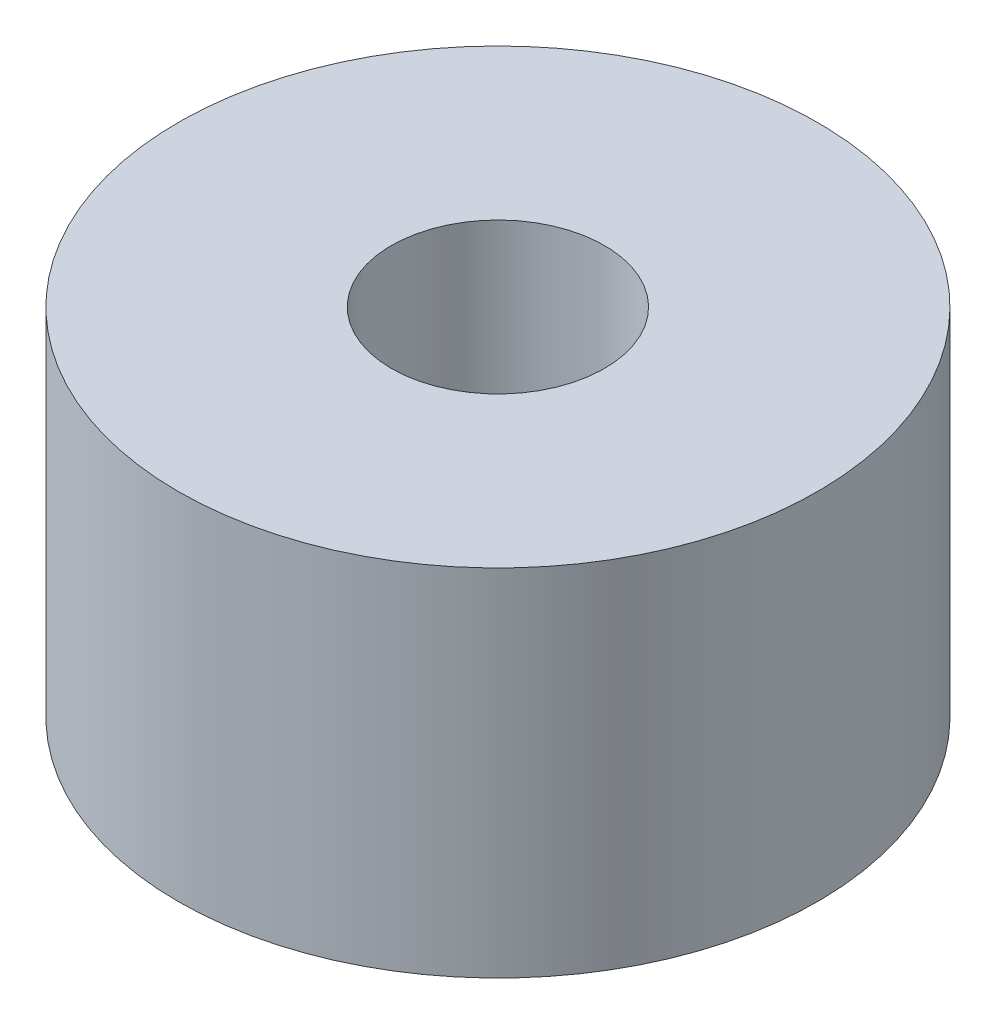
ISO-10303-21;
HEADER;
FILE_DESCRIPTION(('STEP AP214'),'2;1');
FILE_NAME('part.step','',(''),(''),'','','');
FILE_SCHEMA(('AUTOMOTIVE_DESIGN { 1 0 10303 214 1 1 1 1 }'));
ENDSEC;
DATA;
#1=APPLICATION_CONTEXT('core data for automotive mechanical design processes');
#2=APPLICATION_PROTOCOL_DEFINITION('international standard','automotive_design',2000,#1);
#3=PRODUCT_CONTEXT('',#1,'mechanical');
#4=PRODUCT('Part','Part','',(#3));
#5=PRODUCT_RELATED_PRODUCT_CATEGORY('part','',(#4));
#6=PRODUCT_DEFINITION_FORMATION('','',#4);
#7=PRODUCT_DEFINITION_CONTEXT('part definition',#1,'design');
#8=PRODUCT_DEFINITION('design','',#6,#7);
#9=PRODUCT_DEFINITION_SHAPE('','',#8);
#10=(LENGTH_UNIT() NAMED_UNIT(*) SI_UNIT(.MILLI.,.METRE.));
#11=(NAMED_UNIT(*) PLANE_ANGLE_UNIT() SI_UNIT($,.RADIAN.));
#12=(NAMED_UNIT(*) SI_UNIT($,.STERADIAN.) SOLID_ANGLE_UNIT());
#13=UNCERTAINTY_MEASURE_WITH_UNIT(LENGTH_MEASURE(1.E-05),#10,'distance_accuracy_value','');
#14=(GEOMETRIC_REPRESENTATION_CONTEXT(3) GLOBAL_UNCERTAINTY_ASSIGNED_CONTEXT((#13)) GLOBAL_UNIT_ASSIGNED_CONTEXT((#10,
#11,#12)) REPRESENTATION_CONTEXT('',''));
#15=CARTESIAN_POINT('',(0.,0.,0.));
#16=DIRECTION('',(0.,0.,1.));
#17=DIRECTION('',(1.,0.,0.));
#18=AXIS2_PLACEMENT_3D('',#15,#16,#17);
#19=CARTESIAN_POINT('',(0.,5.,0.));
#20=DIRECTION('',(0.,1.,0.));
#21=DIRECTION('',(0.,0.,1.));
#22=AXIS2_PLACEMENT_3D('',#19,#20,#21);
#23=PLANE('',#22);
#24=CARTESIAN_POINT('',(0.,5.,0.));
#25=DIRECTION('',(0.,1.,0.));
#26=DIRECTION('',(0.,0.,1.));
#27=AXIS2_PLACEMENT_3D('',#24,#25,#26);
#28=CIRCLE('',#27,4.5);
#29=CARTESIAN_POINT('',(0.,5.,4.5));
#30=VERTEX_POINT('',#29);
#31=EDGE_CURVE('E10',#30,#30,#28,.T.);
#32=ORIENTED_EDGE('',*,*,#31,.T.);
#33=EDGE_LOOP('',(#32));
#34=FACE_BOUND('',#33,.T.);
#35=CARTESIAN_POINT('',(0.,5.,0.));
#36=DIRECTION('',(0.,1.,0.));
#37=DIRECTION('',(0.,0.,1.));
#38=AXIS2_PLACEMENT_3D('',#35,#36,#37);
#39=CIRCLE('',#38,1.5);
#40=CARTESIAN_POINT('',(0.,5.,1.5));
#41=VERTEX_POINT('',#40);
#42=EDGE_CURVE('E41',#41,#41,#39,.T.);
#43=ORIENTED_EDGE('',*,*,#42,.F.);
#44=EDGE_LOOP('',(#43));
#45=FACE_BOUND('',#44,.T.);
#46=ADVANCED_FACE('F30',(#34,#45),#23,.T.);
#47=CARTESIAN_POINT('',(0.,0.,0.));
#48=DIRECTION('',(0.,1.,0.));
#49=DIRECTION('',(0.,0.,1.));
#50=AXIS2_PLACEMENT_3D('',#47,#48,#49);
#51=PLANE('',#50);
#52=CARTESIAN_POINT('',(0.,0.,0.));
#53=DIRECTION('',(0.,1.,0.));
#54=DIRECTION('',(0.,0.,1.));
#55=AXIS2_PLACEMENT_3D('',#52,#53,#54);
#56=CIRCLE('',#55,4.5);
#57=CARTESIAN_POINT('',(0.,0.,4.5));
#58=VERTEX_POINT('',#57);
#59=EDGE_CURVE('E34',#58,#58,#56,.T.);
#60=ORIENTED_EDGE('',*,*,#59,.F.);
#61=EDGE_LOOP('',(#60));
#62=FACE_BOUND('',#61,.T.);
#63=CARTESIAN_POINT('',(0.,0.,0.));
#64=DIRECTION('',(0.,1.,0.));
#65=DIRECTION('',(0.,0.,1.));
#66=AXIS2_PLACEMENT_3D('',#63,#64,#65);
#67=CIRCLE('',#66,1.5);
#68=CARTESIAN_POINT('',(0.,0.,1.5));
#69=VERTEX_POINT('',#68);
#70=EDGE_CURVE('E43',#69,#69,#67,.T.);
#71=ORIENTED_EDGE('',*,*,#70,.T.);
#72=EDGE_LOOP('',(#71));
#73=FACE_BOUND('',#72,.T.);
#74=ADVANCED_FACE('F53',(#62,#73),#51,.F.);
#75=CARTESIAN_POINT('',(0.,5.,0.));
#76=DIRECTION('',(0.,-1.,0.));
#77=DIRECTION('',(0.,0.,-1.));
#78=AXIS2_PLACEMENT_3D('',#75,#76,#77);
#79=CYLINDRICAL_SURFACE('',#78,4.5);
#80=ORIENTED_EDGE('',*,*,#31,.F.);
#81=EDGE_LOOP('',(#80));
#82=FACE_BOUND('',#81,.T.);
#83=ORIENTED_EDGE('',*,*,#59,.T.);
#84=EDGE_LOOP('',(#83));
#85=FACE_BOUND('',#84,.T.);
#86=ADVANCED_FACE('F32',(#82,#85),#79,.T.);
#87=CARTESIAN_POINT('',(0.,5.,0.));
#88=DIRECTION('',(0.,-1.,0.));
#89=DIRECTION('',(0.,0.,-1.));
#90=AXIS2_PLACEMENT_3D('',#87,#88,#89);
#91=CYLINDRICAL_SURFACE('',#90,1.5);
#92=ORIENTED_EDGE('',*,*,#42,.T.);
#93=EDGE_LOOP('',(#92));
#94=FACE_BOUND('',#93,.T.);
#95=ORIENTED_EDGE('',*,*,#70,.F.);
#96=EDGE_LOOP('',(#95));
#97=FACE_BOUND('',#96,.T.);
#98=ADVANCED_FACE('F49',(#94,#97),#91,.F.);
#99=CLOSED_SHELL('',(#46,#74,#86,#98));
#100=MANIFOLD_SOLID_BREP('B2',#99);
#101=ADVANCED_BREP_SHAPE_REPRESENTATION('',(#18,#100),#14);
#102=SHAPE_DEFINITION_REPRESENTATION(#9,#101);
ENDSEC;
END-ISO-10303-21;
